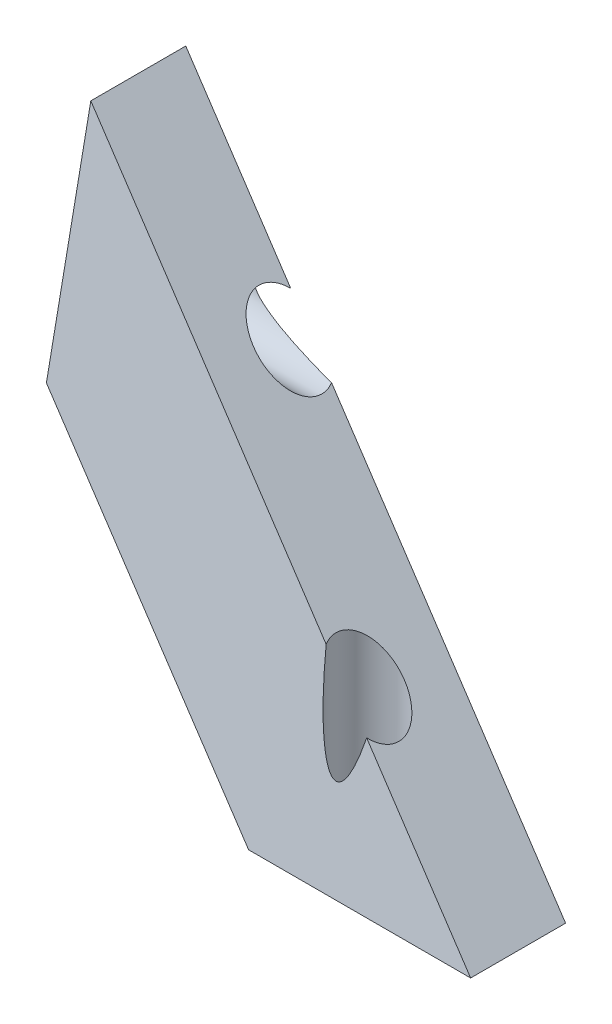
ISO-10303-21;
HEADER;
FILE_DESCRIPTION(('STEP AP214'),'2;1');
FILE_NAME('part.step','',(''),(''),'','','');
FILE_SCHEMA(('AUTOMOTIVE_DESIGN { 1 0 10303 214 1 1 1 1 }'));
ENDSEC;
DATA;
#1=APPLICATION_CONTEXT('core data for automotive mechanical design processes');
#2=APPLICATION_PROTOCOL_DEFINITION('international standard','automotive_design',2000,#1);
#3=PRODUCT_CONTEXT('',#1,'mechanical');
#4=PRODUCT('Part','Part','',(#3));
#5=PRODUCT_RELATED_PRODUCT_CATEGORY('part','',(#4));
#6=PRODUCT_DEFINITION_FORMATION('','',#4);
#7=PRODUCT_DEFINITION_CONTEXT('part definition',#1,'design');
#8=PRODUCT_DEFINITION('design','',#6,#7);
#9=PRODUCT_DEFINITION_SHAPE('','',#8);
#10=(LENGTH_UNIT() NAMED_UNIT(*) SI_UNIT(.MILLI.,.METRE.));
#11=(NAMED_UNIT(*) PLANE_ANGLE_UNIT() SI_UNIT($,.RADIAN.));
#12=(NAMED_UNIT(*) SI_UNIT($,.STERADIAN.) SOLID_ANGLE_UNIT());
#13=UNCERTAINTY_MEASURE_WITH_UNIT(LENGTH_MEASURE(1.E-05),#10,'distance_accuracy_value','');
#14=(GEOMETRIC_REPRESENTATION_CONTEXT(3) GLOBAL_UNCERTAINTY_ASSIGNED_CONTEXT((#13)) GLOBAL_UNIT_ASSIGNED_CONTEXT((#10,
#11,#12)) REPRESENTATION_CONTEXT('',''));
#15=CARTESIAN_POINT('',(0.,0.,0.));
#16=DIRECTION('',(0.,0.,1.));
#17=DIRECTION('',(1.,0.,0.));
#18=AXIS2_PLACEMENT_3D('',#15,#16,#17);
#19=CARTESIAN_POINT('',(-57.5079157734075,63.5,22.2464832070813));
#20=DIRECTION('',(1.,0.,0.));
#21=DIRECTION('',(0.,0.,-1.));
#22=AXIS2_PLACEMENT_3D('',#19,#20,#21);
#23=PLANE('',#22);
#24=DIRECTION('',(0.,0.,1.));
#25=VECTOR('',#24,1.);
#26=CARTESIAN_POINT('',(-57.5079157734075,53.4,1.24648320708115));
#27=LINE('',#26,#25);
#28=CARTESIAN_POINT('',(-57.5079157734075,53.4,2.74648320708115));
#29=VERTEX_POINT('',#28);
#30=CARTESIAN_POINT('',(-57.5079157734075,53.4,3.94648320708115));
#31=VERTEX_POINT('',#30);
#32=EDGE_CURVE('E202',#29,#31,#27,.T.);
#33=ORIENTED_EDGE('',*,*,#32,.F.);
#34=CARTESIAN_POINT('',(-57.5079157734075,54.9,2.74648320708115));
#35=DIRECTION('',(1.,0.,0.));
#36=DIRECTION('',(0.,0.,-1.));
#37=AXIS2_PLACEMENT_3D('',#34,#35,#36);
#38=CIRCLE('',#37,1.5);
#39=CARTESIAN_POINT('',(-57.5079157734075,54.9,1.24648320708115));
#40=VERTEX_POINT('',#39);
#41=EDGE_CURVE('E320',#29,#40,#38,.T.);
#42=ORIENTED_EDGE('',*,*,#41,.T.);
#43=DIRECTION('',(0.,-1.,0.));
#44=VECTOR('',#43,1.);
#45=CARTESIAN_POINT('',(-57.5079157734075,53.4,1.24648320708115));
#46=LINE('',#45,#44);
#47=CARTESIAN_POINT('',(-57.5079157734075,56.1,1.24648320708115));
#48=VERTEX_POINT('',#47);
#49=EDGE_CURVE('E213',#48,#40,#46,.T.);
#50=ORIENTED_EDGE('',*,*,#49,.F.);
#51=CARTESIAN_POINT('',(-57.5079157734075,56.1,2.74648320708115));
#52=DIRECTION('',(1.,0.,0.));
#53=DIRECTION('',(0.,0.,-1.));
#54=AXIS2_PLACEMENT_3D('',#51,#52,#53);
#55=CIRCLE('',#54,1.5);
#56=CARTESIAN_POINT('',(-57.5079157734075,57.6,2.74648320708115));
#57=VERTEX_POINT('',#56);
#58=EDGE_CURVE('E322',#48,#57,#55,.T.);
#59=ORIENTED_EDGE('',*,*,#58,.T.);
#60=DIRECTION('',(0.,0.,-1.));
#61=VECTOR('',#60,1.);
#62=CARTESIAN_POINT('',(-57.5079157734075,57.6,1.24648320708115));
#63=LINE('',#62,#61);
#64=CARTESIAN_POINT('',(-57.5079157734075,57.6,3.94648320708115));
#65=VERTEX_POINT('',#64);
#66=EDGE_CURVE('E228',#65,#57,#63,.T.);
#67=ORIENTED_EDGE('',*,*,#66,.F.);
#68=CARTESIAN_POINT('',(-57.5079157734075,56.1,3.94648320708115));
#69=DIRECTION('',(1.,0.,0.));
#70=DIRECTION('',(0.,0.,-1.));
#71=AXIS2_PLACEMENT_3D('',#68,#69,#70);
#72=CIRCLE('',#71,1.5);
#73=CARTESIAN_POINT('',(-57.5079157734075,56.1,5.44648320708115));
#74=VERTEX_POINT('',#73);
#75=EDGE_CURVE('E324',#65,#74,#72,.T.);
#76=ORIENTED_EDGE('',*,*,#75,.T.);
#77=DIRECTION('',(0.,1.,0.));
#78=VECTOR('',#77,1.);
#79=CARTESIAN_POINT('',(-57.5079157734075,53.4,5.44648320708115));
#80=LINE('',#79,#78);
#81=CARTESIAN_POINT('',(-57.5079157734075,54.9,5.44648320708115));
#82=VERTEX_POINT('',#81);
#83=EDGE_CURVE('E225',#82,#74,#80,.T.);
#84=ORIENTED_EDGE('',*,*,#83,.F.);
#85=CARTESIAN_POINT('',(-57.5079157734075,54.9,3.94648320708115));
#86=DIRECTION('',(1.,0.,0.));
#87=DIRECTION('',(0.,0.,-1.));
#88=AXIS2_PLACEMENT_3D('',#85,#86,#87);
#89=CIRCLE('',#88,1.5);
#90=EDGE_CURVE('E326',#82,#31,#89,.T.);
#91=ORIENTED_EDGE('',*,*,#90,.T.);
#92=EDGE_LOOP('',(#33,#42,#50,#59,#67,#76,#84,#91));
#93=FACE_BOUND('',#92,.T.);
#94=CARTESIAN_POINT('',(-57.5079157734075,43.,3.34648320708119));
#95=DIRECTION('',(1.,0.,0.));
#96=DIRECTION('',(0.,0.,-1.));
#97=AXIS2_PLACEMENT_3D('',#94,#95,#96);
#98=CIRCLE('',#97,2.385);
#99=CARTESIAN_POINT('',(-57.5079157734075,43.,0.961483207081194));
#100=VERTEX_POINT('',#99);
#101=EDGE_CURVE('E355',#100,#100,#98,.T.);
#102=ORIENTED_EDGE('',*,*,#101,.T.);
#103=EDGE_LOOP('',(#102));
#104=FACE_BOUND('',#103,.T.);
#105=DIRECTION('',(0.,0.,-1.));
#106=VECTOR('',#105,1.);
#107=CARTESIAN_POINT('',(-57.5079157734075,33.801515190165,22.2464832070813));
#108=LINE('',#107,#106);
#109=CARTESIAN_POINT('',(-57.5079157734075,33.801515190165,15.4861801690483));
#110=VERTEX_POINT('',#109);
#111=CARTESIAN_POINT('',(-57.5079157734075,33.801515190165,-3.15351679291868));
#112=VERTEX_POINT('',#111);
#113=EDGE_CURVE('E47',#110,#112,#108,.T.);
#114=ORIENTED_EDGE('',*,*,#113,.F.);
#115=DIRECTION('',(0.,-0.98058067569092,0.196116135138184));
#116=VECTOR('',#115,1.);
#117=CARTESIAN_POINT('',(-57.5079157734075,0.,22.2464832070813));
#118=LINE('',#117,#116);
#119=CARTESIAN_POINT('',(-57.5079157734075,63.5,9.54648320708132));
#120=VERTEX_POINT('',#119);
#121=EDGE_CURVE('E198',#120,#110,#118,.T.);
#122=ORIENTED_EDGE('',*,*,#121,.F.);
#123=DIRECTION('',(0.,0.,1.));
#124=VECTOR('',#123,1.);
#125=CARTESIAN_POINT('',(-57.5079157734075,63.5,22.2464832070813));
#126=LINE('',#125,#124);
#127=CARTESIAN_POINT('',(-57.5079157734075,63.5,-3.15351679291868));
#128=VERTEX_POINT('',#127);
#129=EDGE_CURVE('E256',#128,#120,#126,.T.);
#130=ORIENTED_EDGE('',*,*,#129,.F.);
#131=DIRECTION('',(0.,-1.,0.));
#132=VECTOR('',#131,1.);
#133=CARTESIAN_POINT('',(-57.5079157734075,63.5,-3.15351679291868));
#134=LINE('',#133,#132);
#135=EDGE_CURVE('E259',#128,#112,#134,.T.);
#136=ORIENTED_EDGE('',*,*,#135,.T.);
#137=EDGE_LOOP('',(#114,#122,#130,#136));
#138=FACE_BOUND('',#137,.T.);
#139=ADVANCED_FACE('F33',(#93,#104,#138),#23,.F.);
#140=CARTESIAN_POINT('',(0.,0.,0.));
#141=DIRECTION('',(0.,-1.,0.));
#142=DIRECTION('',(0.,0.,-1.));
#143=AXIS2_PLACEMENT_3D('',#140,#141,#142);
#144=PLANE('',#143);
#145=DIRECTION('',(0.,0.,-1.));
#146=VECTOR('',#145,1.);
#147=CARTESIAN_POINT('',(-3.70791577340748,0.,17.8464832070813));
#148=LINE('',#147,#146);
#149=CARTESIAN_POINT('',(-3.70791577340748,0.,16.3464832070813));
#150=VERTEX_POINT('',#149);
#151=CARTESIAN_POINT('',(-3.70791577340748,0.,15.1464832070813));
#152=VERTEX_POINT('',#151);
#153=EDGE_CURVE('E248',#150,#152,#148,.T.);
#154=ORIENTED_EDGE('',*,*,#153,.F.);
#155=CARTESIAN_POINT('',(-2.20791577340748,0.,16.3464832070813));
#156=DIRECTION('',(0.,-1.,0.));
#157=DIRECTION('',(0.,0.,-1.));
#158=AXIS2_PLACEMENT_3D('',#155,#156,#157);
#159=CIRCLE('',#158,1.5);
#160=CARTESIAN_POINT('',(-2.20791577340748,0.,17.8464832070813));
#161=VERTEX_POINT('',#160);
#162=EDGE_CURVE('E334',#150,#161,#159,.F.);
#163=ORIENTED_EDGE('',*,*,#162,.T.);
#164=DIRECTION('',(-1.,0.,0.));
#165=VECTOR('',#164,1.);
#166=CARTESIAN_POINT('',(-3.70791577340748,0.,17.8464832070813));
#167=LINE('',#166,#165);
#168=CARTESIAN_POINT('',(-1.00791577340747,0.,17.8464832070813));
#169=VERTEX_POINT('',#168);
#170=EDGE_CURVE('E222',#169,#161,#167,.T.);
#171=ORIENTED_EDGE('',*,*,#170,.F.);
#172=CARTESIAN_POINT('',(-1.00791577340747,0.,16.3464832070813));
#173=DIRECTION('',(0.,-1.,0.));
#174=DIRECTION('',(0.,0.,-1.));
#175=AXIS2_PLACEMENT_3D('',#172,#173,#174);
#176=CIRCLE('',#175,1.5);
#177=CARTESIAN_POINT('',(0.492084226592529,0.,16.3464832070813));
#178=VERTEX_POINT('',#177);
#179=EDGE_CURVE('E328',#169,#178,#176,.F.);
#180=ORIENTED_EDGE('',*,*,#179,.T.);
#181=DIRECTION('',(0.,0.,1.));
#182=VECTOR('',#181,1.);
#183=CARTESIAN_POINT('',(0.492084226592526,0.,17.8464832070813));
#184=LINE('',#183,#182);
#185=CARTESIAN_POINT('',(0.492084226592531,0.,15.1464832070813));
#186=VERTEX_POINT('',#185);
#187=EDGE_CURVE('E237',#186,#178,#184,.T.);
#188=ORIENTED_EDGE('',*,*,#187,.F.);
#189=CARTESIAN_POINT('',(-1.00791577340747,0.,15.1464832070813));
#190=DIRECTION('',(0.,-1.,0.));
#191=DIRECTION('',(0.,0.,-1.));
#192=AXIS2_PLACEMENT_3D('',#189,#190,#191);
#193=CIRCLE('',#192,1.5);
#194=CARTESIAN_POINT('',(-1.00791577340747,0.,13.6464832070813));
#195=VERTEX_POINT('',#194);
#196=EDGE_CURVE('E330',#186,#195,#193,.F.);
#197=ORIENTED_EDGE('',*,*,#196,.T.);
#198=DIRECTION('',(1.,0.,0.));
#199=VECTOR('',#198,1.);
#200=CARTESIAN_POINT('',(-3.70791577340748,0.,13.6464832070813));
#201=LINE('',#200,#199);
#202=CARTESIAN_POINT('',(-2.20791577340748,0.,13.6464832070813));
#203=VERTEX_POINT('',#202);
#204=EDGE_CURVE('E251',#203,#195,#201,.T.);
#205=ORIENTED_EDGE('',*,*,#204,.F.);
#206=CARTESIAN_POINT('',(-2.20791577340748,0.,15.1464832070813));
#207=DIRECTION('',(0.,-1.,0.));
#208=DIRECTION('',(0.,0.,-1.));
#209=AXIS2_PLACEMENT_3D('',#206,#207,#208);
#210=CIRCLE('',#209,1.5);
#211=EDGE_CURVE('E332',#203,#152,#210,.F.);
#212=ORIENTED_EDGE('',*,*,#211,.T.);
#213=EDGE_LOOP('',(#154,#163,#171,#180,#188,#197,#205,#212));
#214=FACE_BOUND('',#213,.T.);
#215=CARTESIAN_POINT('',(-14.3079157734075,0.,15.7464832070813));
#216=DIRECTION('',(0.,-1.,0.));
#217=DIRECTION('',(0.,0.,-1.));
#218=AXIS2_PLACEMENT_3D('',#215,#216,#217);
#219=CIRCLE('',#218,2.385);
#220=CARTESIAN_POINT('',(-14.3079157734075,0.,13.3614832070813));
#221=VERTEX_POINT('',#220);
#222=EDGE_CURVE('E199',#221,#221,#219,.T.);
#223=ORIENTED_EDGE('',*,*,#222,.F.);
#224=EDGE_LOOP('',(#223));
#225=FACE_BOUND('',#224,.T.);
#226=DIRECTION('',(1.,0.,0.));
#227=VECTOR('',#226,1.);
#228=CARTESIAN_POINT('',(-57.5079157734075,0.,22.2464832070813));
#229=LINE('',#228,#227);
#230=CARTESIAN_POINT('',(-23.7064005832425,0.,22.2464832070813));
#231=VERTEX_POINT('',#230);
#232=CARTESIAN_POINT('',(5.99208422659253,0.,22.2464832070813));
#233=VERTEX_POINT('',#232);
#234=EDGE_CURVE('E193',#231,#233,#229,.T.);
#235=ORIENTED_EDGE('',*,*,#234,.F.);
#236=DIRECTION('',(0.,0.,-1.));
#237=VECTOR('',#236,1.);
#238=CARTESIAN_POINT('',(-23.7064005832425,0.,0.));
#239=LINE('',#238,#237);
#240=CARTESIAN_POINT('',(-23.7064005832425,0.,3.60678624511432));
#241=VERTEX_POINT('',#240);
#242=EDGE_CURVE('E180',#231,#241,#239,.T.);
#243=ORIENTED_EDGE('',*,*,#242,.T.);
#244=DIRECTION('',(-0.98058067569092,0.,-0.196116135138184));
#245=VECTOR('',#244,1.);
#246=CARTESIAN_POINT('',(-57.5079157734075,0.,-3.15351679291868));
#247=LINE('',#246,#245);
#248=CARTESIAN_POINT('',(5.99208422659253,0.,9.54648320708132));
#249=VERTEX_POINT('',#248);
#250=EDGE_CURVE('E191',#249,#241,#247,.T.);
#251=ORIENTED_EDGE('',*,*,#250,.F.);
#252=DIRECTION('',(0.,0.,-1.));
#253=VECTOR('',#252,1.);
#254=CARTESIAN_POINT('',(5.99208422659253,0.,22.2464832070813));
#255=LINE('',#254,#253);
#256=EDGE_CURVE('E260',#233,#249,#255,.T.);
#257=ORIENTED_EDGE('',*,*,#256,.F.);
#258=EDGE_LOOP('',(#235,#243,#251,#257));
#259=FACE_BOUND('',#258,.T.);
#260=ADVANCED_FACE('F189',(#214,#225,#259),#144,.T.);
#261=CARTESIAN_POINT('',(5.99208422659253,0.,22.2464832070813));
#262=DIRECTION('',(0.,-0.196116135138184,-0.98058067569092));
#263=DIRECTION('',(0.,0.98058067569092,-0.196116135138184));
#264=AXIS2_PLACEMENT_3D('',#261,#262,#263);
#265=PLANE('',#264);
#266=DIRECTION('',(-0.700140042014005,0.700140042014005,-0.140028008402801));
#267=VECTOR('',#266,1.);
#268=CARTESIAN_POINT('',(-9.14831979410768,-14.5580807891348,25.1580993649083));
#269=LINE('',#268,#267);
#270=EDGE_CURVE('E375',#231,#110,#269,.T.);
#271=ORIENTED_EDGE('',*,*,#270,.F.);
#272=ORIENTED_EDGE('',*,*,#234,.T.);
#273=DIRECTION('',(0.700140042014005,-0.700140042014005,0.140028008402801));
#274=VECTOR('',#273,1.);
#275=CARTESIAN_POINT('',(-58.7530138126232,64.7450980392157,9.29746359923818));
#276=LINE('',#275,#274);
#277=CARTESIAN_POINT('',(-11.3923126336087,17.3843968602013,18.7696038350411));
#278=VERTEX_POINT('',#277);
#279=EDGE_CURVE('E336',#278,#233,#276,.T.);
#280=ORIENTED_EDGE('',*,*,#279,.F.);
#281=CARTESIAN_POINT('',(-14.3079157734075,32.5,15.7464832070813));
#282=DIRECTION('',(0.,-0.196116135138184,-0.98058067569092));
#283=DIRECTION('',(0.,-0.98058067569092,0.196116135138184));
#284=AXIS2_PLACEMENT_3D('',#281,#282,#283);
#285=ELLIPSE('',#284,21.4158819570897,4.2);
#286=CARTESIAN_POINT('',(-18.1619804516677,24.1540646782603,17.4156702714293));
#287=VERTEX_POINT('',#286);
#288=EDGE_CURVE('E342',#287,#278,#285,.F.);
#289=ORIENTED_EDGE('',*,*,#288,.F.);
#290=EDGE_CURVE('E337',#120,#287,#276,.T.);
#291=ORIENTED_EDGE('',*,*,#290,.F.);
#292=ORIENTED_EDGE('',*,*,#121,.T.);
#293=EDGE_LOOP('',(#271,#272,#280,#289,#291,#292));
#294=FACE_BOUND('',#293,.T.);
#295=ADVANCED_FACE('F365',(#294),#265,.F.);
#296=CARTESIAN_POINT('',(-57.5079157734075,63.5,-3.15351679291868));
#297=DIRECTION('',(-0.196116135138184,0.,0.98058067569092));
#298=DIRECTION('',(0.98058067569092,0.,0.196116135138184));
#299=AXIS2_PLACEMENT_3D('',#296,#297,#298);
#300=PLANE('',#299);
#301=DIRECTION('',(0.700140042014005,-0.700140042014005,0.140028008402801));
#302=VECTOR('',#301,1.);
#303=CARTESIAN_POINT('',(-72.0659965625423,48.3595959792998,-6.06513295074564));
#304=LINE('',#303,#302);
#305=EDGE_CURVE('E11',#112,#241,#304,.T.);
#306=ORIENTED_EDGE('',*,*,#305,.F.);
#307=ORIENTED_EDGE('',*,*,#135,.F.);
#308=DIRECTION('',(-0.700140042014005,0.700140042014005,-0.140028008402801));
#309=VECTOR('',#308,1.);
#310=CARTESIAN_POINT('',(-57.5079157734075,63.5,-3.15351679291868));
#311=LINE('',#310,#309);
#312=CARTESIAN_POINT('',(-39.9575493501217,45.9496335767142,0.356556491738479));
#313=VERTEX_POINT('',#312);
#314=EDGE_CURVE('E340',#313,#128,#311,.T.);
#315=ORIENTED_EDGE('',*,*,#314,.F.);
#316=CARTESIAN_POINT('',(-25.0079157734081,43.,3.34648320708119));
#317=DIRECTION('',(-0.196116135138184,0.,0.98058067569092));
#318=DIRECTION('',(0.98058067569092,0.,0.196116135138184));
#319=AXIS2_PLACEMENT_3D('',#316,#317,#318);
#320=ELLIPSE('',#319,21.4158819570897,4.2);
#321=CARTESIAN_POINT('',(-33.1352052736164,39.1272895002089,1.72102530703954));
#322=VERTEX_POINT('',#321);
#323=EDGE_CURVE('E41',#322,#313,#320,.F.);
#324=ORIENTED_EDGE('',*,*,#323,.F.);
#325=EDGE_CURVE('E197',#249,#322,#311,.T.);
#326=ORIENTED_EDGE('',*,*,#325,.F.);
#327=ORIENTED_EDGE('',*,*,#250,.T.);
#328=EDGE_LOOP('',(#306,#307,#315,#324,#326,#327));
#329=FACE_BOUND('',#328,.T.);
#330=ADVANCED_FACE('F195',(#329),#300,.F.);
#331=CARTESIAN_POINT('',(-14.3079157734075,63.5,15.7464832070813));
#332=DIRECTION('',(0.,-1.,0.));
#333=DIRECTION('',(0.,0.,-1.));
#334=AXIS2_PLACEMENT_3D('',#331,#332,#333);
#335=CYLINDRICAL_SURFACE('',#334,2.385);
#336=ORIENTED_EDGE('',*,*,#222,.T.);
#337=EDGE_LOOP('',(#336));
#338=FACE_BOUND('',#337,.T.);
#339=CARTESIAN_POINT('',(-14.3079157734075,5.2041474947892,15.7464832070813));
#340=DIRECTION('',(0.,1.,0.));
#341=DIRECTION('',(0.,0.,1.));
#342=AXIS2_PLACEMENT_3D('',#339,#340,#341);
#343=CIRCLE('',#342,2.385);
#344=CARTESIAN_POINT('',(-14.3079157734075,5.2041474947892,18.1314832070813));
#345=VERTEX_POINT('',#344);
#346=EDGE_CURVE('E343',#345,#345,#343,.F.);
#347=ORIENTED_EDGE('',*,*,#346,.F.);
#348=EDGE_LOOP('',(#347));
#349=FACE_BOUND('',#348,.T.);
#350=ADVANCED_FACE('F469',(#338,#349),#335,.F.);
#351=CARTESIAN_POINT('',(-57.5079157734075,63.5,-3.15351679291868));
#352=DIRECTION('',(-0.707106781186548,-0.707106781186548,0.));
#353=DIRECTION('',(0.707106781186548,-0.707106781186548,0.));
#354=AXIS2_PLACEMENT_3D('',#351,#352,#353);
#355=PLANE('',#354);
#356=CARTESIAN_POINT('',(-37.0079157734075,43.,3.34648320708119));
#357=DIRECTION('',(-0.707106781186548,-0.707106781186548,0.));
#358=DIRECTION('',(0.707106781186548,-0.707106781186548,0.));
#359=AXIS2_PLACEMENT_3D('',#356,#357,#358);
#360=ELLIPSE('',#359,5.939696961967,4.2);
#361=EDGE_CURVE('E54',#313,#322,#360,.F.);
#362=ORIENTED_EDGE('',*,*,#361,.F.);
#363=ORIENTED_EDGE('',*,*,#314,.T.);
#364=ORIENTED_EDGE('',*,*,#129,.T.);
#365=ORIENTED_EDGE('',*,*,#290,.T.);
#366=CARTESIAN_POINT('',(-14.3079157734075,20.3,15.7464832070813));
#367=DIRECTION('',(-0.707106781186548,-0.707106781186548,0.));
#368=DIRECTION('',(0.707106781186548,-0.707106781186548,0.));
#369=AXIS2_PLACEMENT_3D('',#366,#367,#368);
#370=ELLIPSE('',#369,5.939696961967,4.2);
#371=EDGE_CURVE('E205',#278,#287,#370,.F.);
#372=ORIENTED_EDGE('',*,*,#371,.F.);
#373=ORIENTED_EDGE('',*,*,#279,.T.);
#374=ORIENTED_EDGE('',*,*,#256,.T.);
#375=ORIENTED_EDGE('',*,*,#325,.T.);
#376=EDGE_LOOP('',(#362,#363,#364,#365,#372,#373,#374,#375));
#377=FACE_BOUND('',#376,.T.);
#378=ADVANCED_FACE('F354',(#377),#355,.F.);
#379=CARTESIAN_POINT('',(-3.70791577340748,-3.5,17.8464832070813));
#380=DIRECTION('',(0.,0.,-1.));
#381=DIRECTION('',(-1.,0.,0.));
#382=AXIS2_PLACEMENT_3D('',#379,#380,#381);
#383=PLANE('',#382);
#384=DIRECTION('',(-1.,0.,0.));
#385=VECTOR('',#384,1.);
#386=CARTESIAN_POINT('',(-3.70791577340748,-3.5,17.8464832070813));
#387=LINE('',#386,#385);
#388=CARTESIAN_POINT('',(-1.00791577340747,-3.5,17.8464832070813));
#389=VERTEX_POINT('',#388);
#390=CARTESIAN_POINT('',(-2.20791577340748,-3.5,17.8464832070813));
#391=VERTEX_POINT('',#390);
#392=EDGE_CURVE('E233',#389,#391,#387,.T.);
#393=ORIENTED_EDGE('',*,*,#392,.F.);
#394=DIRECTION('',(0.,1.,0.));
#395=VECTOR('',#394,1.);
#396=CARTESIAN_POINT('',(-1.00791577340747,-3.5,17.8464832070813));
#397=LINE('',#396,#395);
#398=EDGE_CURVE('E294',#389,#169,#397,.T.);
#399=ORIENTED_EDGE('',*,*,#398,.T.);
#400=ORIENTED_EDGE('',*,*,#170,.T.);
#401=DIRECTION('',(0.,1.,0.));
#402=VECTOR('',#401,1.);
#403=CARTESIAN_POINT('',(-2.20791577340748,-3.5,17.8464832070813));
#404=LINE('',#403,#402);
#405=EDGE_CURVE('E292',#161,#391,#404,.F.);
#406=ORIENTED_EDGE('',*,*,#405,.T.);
#407=EDGE_LOOP('',(#393,#399,#400,#406));
#408=FACE_BOUND('',#407,.T.);
#409=ADVANCED_FACE('F459',(#408),#383,.F.);
#410=CARTESIAN_POINT('',(-3.70791577340748,-3.5,17.8464832070813));
#411=DIRECTION('',(1.,0.,0.));
#412=DIRECTION('',(0.,0.,-1.));
#413=AXIS2_PLACEMENT_3D('',#410,#411,#412);
#414=PLANE('',#413);
#415=ORIENTED_EDGE('',*,*,#153,.T.);
#416=DIRECTION('',(0.,1.,0.));
#417=VECTOR('',#416,1.);
#418=CARTESIAN_POINT('',(-3.70791577340748,-3.5,15.1464832070813));
#419=LINE('',#418,#417);
#420=CARTESIAN_POINT('',(-3.70791577340748,-3.5,15.1464832070813));
#421=VERTEX_POINT('',#420);
#422=EDGE_CURVE('E318',#152,#421,#419,.F.);
#423=ORIENTED_EDGE('',*,*,#422,.T.);
#424=DIRECTION('',(0.,0.,-1.));
#425=VECTOR('',#424,1.);
#426=CARTESIAN_POINT('',(-3.70791577340748,-3.5,17.8464832070813));
#427=LINE('',#426,#425);
#428=CARTESIAN_POINT('',(-3.70791577340748,-3.5,16.3464832070813));
#429=VERTEX_POINT('',#428);
#430=EDGE_CURVE('E236',#429,#421,#427,.T.);
#431=ORIENTED_EDGE('',*,*,#430,.F.);
#432=DIRECTION('',(0.,1.,0.));
#433=VECTOR('',#432,1.);
#434=CARTESIAN_POINT('',(-3.70791577340748,-3.5,16.3464832070813));
#435=LINE('',#434,#433);
#436=EDGE_CURVE('E315',#429,#150,#435,.T.);
#437=ORIENTED_EDGE('',*,*,#436,.T.);
#438=EDGE_LOOP('',(#415,#423,#431,#437));
#439=FACE_BOUND('',#438,.T.);
#440=ADVANCED_FACE('F464',(#439),#414,.F.);
#441=CARTESIAN_POINT('',(-3.70791577340748,-3.5,13.6464832070813));
#442=DIRECTION('',(0.,0.,1.));
#443=DIRECTION('',(1.,0.,0.));
#444=AXIS2_PLACEMENT_3D('',#441,#442,#443);
#445=PLANE('',#444);
#446=ORIENTED_EDGE('',*,*,#204,.T.);
#447=DIRECTION('',(0.,1.,0.));
#448=VECTOR('',#447,1.);
#449=CARTESIAN_POINT('',(-1.00791577340747,-3.5,13.6464832070813));
#450=LINE('',#449,#448);
#451=CARTESIAN_POINT('',(-1.00791577340747,-3.5,13.6464832070813));
#452=VERTEX_POINT('',#451);
#453=EDGE_CURVE('E313',#195,#452,#450,.F.);
#454=ORIENTED_EDGE('',*,*,#453,.T.);
#455=DIRECTION('',(1.,0.,0.));
#456=VECTOR('',#455,1.);
#457=CARTESIAN_POINT('',(-3.70791577340748,-3.5,13.6464832070813));
#458=LINE('',#457,#456);
#459=CARTESIAN_POINT('',(-2.20791577340748,-3.5,13.6464832070813));
#460=VERTEX_POINT('',#459);
#461=EDGE_CURVE('E240',#460,#452,#458,.T.);
#462=ORIENTED_EDGE('',*,*,#461,.F.);
#463=DIRECTION('',(0.,1.,0.));
#464=VECTOR('',#463,1.);
#465=CARTESIAN_POINT('',(-2.20791577340748,-3.5,13.6464832070813));
#466=LINE('',#465,#464);
#467=EDGE_CURVE('E310',#460,#203,#466,.T.);
#468=ORIENTED_EDGE('',*,*,#467,.T.);
#469=EDGE_LOOP('',(#446,#454,#462,#468));
#470=FACE_BOUND('',#469,.T.);
#471=ADVANCED_FACE('F445',(#470),#445,.F.);
#472=CARTESIAN_POINT('',(0.492084226592526,-3.5,17.8464832070813));
#473=DIRECTION('',(-1.,0.,0.));
#474=DIRECTION('',(0.,0.,1.));
#475=AXIS2_PLACEMENT_3D('',#472,#473,#474);
#476=PLANE('',#475);
#477=ORIENTED_EDGE('',*,*,#187,.T.);
#478=DIRECTION('',(0.,1.,0.));
#479=VECTOR('',#478,1.);
#480=CARTESIAN_POINT('',(0.492084226592529,-3.5,16.3464832070813));
#481=LINE('',#480,#479);
#482=CARTESIAN_POINT('',(0.492084226592529,-3.5,16.3464832070813));
#483=VERTEX_POINT('',#482);
#484=EDGE_CURVE('E300',#178,#483,#481,.F.);
#485=ORIENTED_EDGE('',*,*,#484,.T.);
#486=DIRECTION('',(0.,0.,1.));
#487=VECTOR('',#486,1.);
#488=CARTESIAN_POINT('',(0.492084226592526,-3.5,17.8464832070813));
#489=LINE('',#488,#487);
#490=CARTESIAN_POINT('',(0.492084226592531,-3.5,15.1464832070813));
#491=VERTEX_POINT('',#490);
#492=EDGE_CURVE('E243',#491,#483,#489,.T.);
#493=ORIENTED_EDGE('',*,*,#492,.F.);
#494=DIRECTION('',(0.,1.,0.));
#495=VECTOR('',#494,1.);
#496=CARTESIAN_POINT('',(0.492084226592531,-3.5,15.1464832070813));
#497=LINE('',#496,#495);
#498=EDGE_CURVE('E297',#491,#186,#497,.T.);
#499=ORIENTED_EDGE('',*,*,#498,.T.);
#500=EDGE_LOOP('',(#477,#485,#493,#499));
#501=FACE_BOUND('',#500,.T.);
#502=ADVANCED_FACE('F452',(#501),#476,.F.);
#503=CARTESIAN_POINT('',(0.,-3.5,0.));
#504=DIRECTION('',(0.,1.,0.));
#505=DIRECTION('',(0.,0.,1.));
#506=AXIS2_PLACEMENT_3D('',#503,#504,#505);
#507=PLANE('',#506);
#508=ORIENTED_EDGE('',*,*,#492,.T.);
#509=CARTESIAN_POINT('',(-1.00791577340747,-3.5,16.3464832070813));
#510=DIRECTION('',(0.,1.,0.));
#511=DIRECTION('',(0.,0.,1.));
#512=AXIS2_PLACEMENT_3D('',#509,#510,#511);
#513=CIRCLE('',#512,1.5);
#514=EDGE_CURVE('E308',#483,#389,#513,.F.);
#515=ORIENTED_EDGE('',*,*,#514,.T.);
#516=ORIENTED_EDGE('',*,*,#392,.T.);
#517=CARTESIAN_POINT('',(-2.20791577340748,-3.5,16.3464832070813));
#518=DIRECTION('',(0.,1.,0.));
#519=DIRECTION('',(0.,0.,1.));
#520=AXIS2_PLACEMENT_3D('',#517,#518,#519);
#521=CIRCLE('',#520,1.5);
#522=EDGE_CURVE('E302',#391,#429,#521,.F.);
#523=ORIENTED_EDGE('',*,*,#522,.T.);
#524=ORIENTED_EDGE('',*,*,#430,.T.);
#525=CARTESIAN_POINT('',(-2.20791577340748,-3.5,15.1464832070813));
#526=DIRECTION('',(0.,1.,0.));
#527=DIRECTION('',(0.,0.,1.));
#528=AXIS2_PLACEMENT_3D('',#525,#526,#527);
#529=CIRCLE('',#528,1.5);
#530=EDGE_CURVE('E304',#421,#460,#529,.F.);
#531=ORIENTED_EDGE('',*,*,#530,.T.);
#532=ORIENTED_EDGE('',*,*,#461,.T.);
#533=CARTESIAN_POINT('',(-1.00791577340747,-3.5,15.1464832070813));
#534=DIRECTION('',(0.,1.,0.));
#535=DIRECTION('',(0.,0.,1.));
#536=AXIS2_PLACEMENT_3D('',#533,#534,#535);
#537=CIRCLE('',#536,1.5);
#538=EDGE_CURVE('E306',#452,#491,#537,.F.);
#539=ORIENTED_EDGE('',*,*,#538,.T.);
#540=EDGE_LOOP('',(#508,#515,#516,#523,#524,#531,#532,#539));
#541=FACE_BOUND('',#540,.T.);
#542=ADVANCED_FACE('F441',(#541),#507,.F.);
#543=CARTESIAN_POINT('',(-61.0079157734075,53.4,1.24648320708115));
#544=DIRECTION('',(0.,1.,0.));
#545=DIRECTION('',(0.,0.,1.));
#546=AXIS2_PLACEMENT_3D('',#543,#544,#545);
#547=PLANE('',#546);
#548=DIRECTION('',(0.,0.,1.));
#549=VECTOR('',#548,1.);
#550=CARTESIAN_POINT('',(-61.0079157734075,53.4,1.24648320708115));
#551=LINE('',#550,#549);
#552=CARTESIAN_POINT('',(-61.0079157734075,53.4,2.74648320708115));
#553=VERTEX_POINT('',#552);
#554=CARTESIAN_POINT('',(-61.0079157734075,53.4,3.94648320708115));
#555=VERTEX_POINT('',#554);
#556=EDGE_CURVE('E209',#553,#555,#551,.T.);
#557=ORIENTED_EDGE('',*,*,#556,.F.);
#558=DIRECTION('',(1.,0.,0.));
#559=VECTOR('',#558,1.);
#560=CARTESIAN_POINT('',(-61.0079157734075,53.4,2.74648320708115));
#561=LINE('',#560,#559);
#562=EDGE_CURVE('E266',#553,#29,#561,.T.);
#563=ORIENTED_EDGE('',*,*,#562,.T.);
#564=ORIENTED_EDGE('',*,*,#32,.T.);
#565=DIRECTION('',(1.,0.,0.));
#566=VECTOR('',#565,1.);
#567=CARTESIAN_POINT('',(-61.0079157734075,53.4,3.94648320708115));
#568=LINE('',#567,#566);
#569=EDGE_CURVE('E264',#31,#555,#568,.F.);
#570=ORIENTED_EDGE('',*,*,#569,.T.);
#571=EDGE_LOOP('',(#557,#563,#564,#570));
#572=FACE_BOUND('',#571,.T.);
#573=ADVANCED_FACE('F503',(#572),#547,.F.);
#574=CARTESIAN_POINT('',(-61.0079157734075,53.4,5.44648320708115));
#575=DIRECTION('',(0.,0.,-1.));
#576=DIRECTION('',(-1.,0.,0.));
#577=AXIS2_PLACEMENT_3D('',#574,#575,#576);
#578=PLANE('',#577);
#579=ORIENTED_EDGE('',*,*,#83,.T.);
#580=DIRECTION('',(1.,0.,0.));
#581=VECTOR('',#580,1.);
#582=CARTESIAN_POINT('',(-61.0079157734075,56.1,5.44648320708115));
#583=LINE('',#582,#581);
#584=CARTESIAN_POINT('',(-61.0079157734075,56.1,5.44648320708115));
#585=VERTEX_POINT('',#584);
#586=EDGE_CURVE('E290',#74,#585,#583,.F.);
#587=ORIENTED_EDGE('',*,*,#586,.T.);
#588=DIRECTION('',(0.,1.,0.));
#589=VECTOR('',#588,1.);
#590=CARTESIAN_POINT('',(-61.0079157734075,53.4,5.44648320708115));
#591=LINE('',#590,#589);
#592=CARTESIAN_POINT('',(-61.0079157734075,54.9,5.44648320708115));
#593=VERTEX_POINT('',#592);
#594=EDGE_CURVE('E212',#593,#585,#591,.T.);
#595=ORIENTED_EDGE('',*,*,#594,.F.);
#596=DIRECTION('',(1.,0.,0.));
#597=VECTOR('',#596,1.);
#598=CARTESIAN_POINT('',(-61.0079157734075,54.9,5.44648320708115));
#599=LINE('',#598,#597);
#600=EDGE_CURVE('E287',#593,#82,#599,.T.);
#601=ORIENTED_EDGE('',*,*,#600,.T.);
#602=EDGE_LOOP('',(#579,#587,#595,#601));
#603=FACE_BOUND('',#602,.T.);
#604=ADVANCED_FACE('F499',(#603),#578,.F.);
#605=CARTESIAN_POINT('',(-61.0079157734075,57.6,1.24648320708115));
#606=DIRECTION('',(0.,-1.,0.));
#607=DIRECTION('',(0.,0.,-1.));
#608=AXIS2_PLACEMENT_3D('',#605,#606,#607);
#609=PLANE('',#608);
#610=ORIENTED_EDGE('',*,*,#66,.T.);
#611=DIRECTION('',(1.,0.,0.));
#612=VECTOR('',#611,1.);
#613=CARTESIAN_POINT('',(-61.0079157734075,57.6,2.74648320708115));
#614=LINE('',#613,#612);
#615=CARTESIAN_POINT('',(-61.0079157734075,57.6,2.74648320708115));
#616=VERTEX_POINT('',#615);
#617=EDGE_CURVE('E285',#57,#616,#614,.F.);
#618=ORIENTED_EDGE('',*,*,#617,.T.);
#619=DIRECTION('',(0.,0.,-1.));
#620=VECTOR('',#619,1.);
#621=CARTESIAN_POINT('',(-61.0079157734075,57.6,1.24648320708115));
#622=LINE('',#621,#620);
#623=CARTESIAN_POINT('',(-61.0079157734075,57.6,3.94648320708115));
#624=VERTEX_POINT('',#623);
#625=EDGE_CURVE('E216',#624,#616,#622,.T.);
#626=ORIENTED_EDGE('',*,*,#625,.F.);
#627=DIRECTION('',(1.,0.,0.));
#628=VECTOR('',#627,1.);
#629=CARTESIAN_POINT('',(-61.0079157734075,57.6,3.94648320708115));
#630=LINE('',#629,#628);
#631=EDGE_CURVE('E282',#624,#65,#630,.T.);
#632=ORIENTED_EDGE('',*,*,#631,.T.);
#633=EDGE_LOOP('',(#610,#618,#626,#632));
#634=FACE_BOUND('',#633,.T.);
#635=ADVANCED_FACE('F495',(#634),#609,.F.);
#636=CARTESIAN_POINT('',(-61.0079157734075,53.4,1.24648320708115));
#637=DIRECTION('',(0.,0.,1.));
#638=DIRECTION('',(1.,0.,0.));
#639=AXIS2_PLACEMENT_3D('',#636,#637,#638);
#640=PLANE('',#639);
#641=ORIENTED_EDGE('',*,*,#49,.T.);
#642=DIRECTION('',(1.,0.,0.));
#643=VECTOR('',#642,1.);
#644=CARTESIAN_POINT('',(-61.0079157734075,54.9,1.24648320708115));
#645=LINE('',#644,#643);
#646=CARTESIAN_POINT('',(-61.0079157734075,54.9,1.24648320708115));
#647=VERTEX_POINT('',#646);
#648=EDGE_CURVE('E272',#40,#647,#645,.F.);
#649=ORIENTED_EDGE('',*,*,#648,.T.);
#650=DIRECTION('',(0.,-1.,0.));
#651=VECTOR('',#650,1.);
#652=CARTESIAN_POINT('',(-61.0079157734075,53.4,1.24648320708115));
#653=LINE('',#652,#651);
#654=CARTESIAN_POINT('',(-61.0079157734075,56.1,1.24648320708115));
#655=VERTEX_POINT('',#654);
#656=EDGE_CURVE('E219',#655,#647,#653,.T.);
#657=ORIENTED_EDGE('',*,*,#656,.F.);
#658=DIRECTION('',(1.,0.,0.));
#659=VECTOR('',#658,1.);
#660=CARTESIAN_POINT('',(-61.0079157734075,56.1,1.24648320708115));
#661=LINE('',#660,#659);
#662=EDGE_CURVE('E269',#655,#48,#661,.T.);
#663=ORIENTED_EDGE('',*,*,#662,.T.);
#664=EDGE_LOOP('',(#641,#649,#657,#663));
#665=FACE_BOUND('',#664,.T.);
#666=ADVANCED_FACE('F491',(#665),#640,.F.);
#667=CARTESIAN_POINT('',(-61.0079157734075,0.,0.));
#668=DIRECTION('',(-1.,0.,0.));
#669=DIRECTION('',(0.,0.,1.));
#670=AXIS2_PLACEMENT_3D('',#667,#668,#669);
#671=PLANE('',#670);
#672=ORIENTED_EDGE('',*,*,#656,.T.);
#673=CARTESIAN_POINT('',(-61.0079157734075,54.9,2.74648320708115));
#674=DIRECTION('',(-1.,0.,0.));
#675=DIRECTION('',(0.,0.,1.));
#676=AXIS2_PLACEMENT_3D('',#673,#674,#675);
#677=CIRCLE('',#676,1.5);
#678=EDGE_CURVE('E280',#647,#553,#677,.T.);
#679=ORIENTED_EDGE('',*,*,#678,.T.);
#680=ORIENTED_EDGE('',*,*,#556,.T.);
#681=CARTESIAN_POINT('',(-61.0079157734075,54.9,3.94648320708115));
#682=DIRECTION('',(-1.,0.,0.));
#683=DIRECTION('',(0.,0.,1.));
#684=AXIS2_PLACEMENT_3D('',#681,#682,#683);
#685=CIRCLE('',#684,1.5);
#686=EDGE_CURVE('E274',#555,#593,#685,.T.);
#687=ORIENTED_EDGE('',*,*,#686,.T.);
#688=ORIENTED_EDGE('',*,*,#594,.T.);
#689=CARTESIAN_POINT('',(-61.0079157734075,56.1,3.94648320708115));
#690=DIRECTION('',(-1.,0.,0.));
#691=DIRECTION('',(0.,0.,1.));
#692=AXIS2_PLACEMENT_3D('',#689,#690,#691);
#693=CIRCLE('',#692,1.5);
#694=EDGE_CURVE('E276',#585,#624,#693,.T.);
#695=ORIENTED_EDGE('',*,*,#694,.T.);
#696=ORIENTED_EDGE('',*,*,#625,.T.);
#697=CARTESIAN_POINT('',(-61.0079157734075,56.1,2.74648320708115));
#698=DIRECTION('',(-1.,0.,0.));
#699=DIRECTION('',(0.,0.,1.));
#700=AXIS2_PLACEMENT_3D('',#697,#698,#699);
#701=CIRCLE('',#700,1.5);
#702=EDGE_CURVE('E278',#616,#655,#701,.T.);
#703=ORIENTED_EDGE('',*,*,#702,.T.);
#704=EDGE_LOOP('',(#672,#679,#680,#687,#688,#695,#696,#703));
#705=FACE_BOUND('',#704,.T.);
#706=ADVANCED_FACE('F409',(#705),#671,.T.);
#707=CARTESIAN_POINT('',(-61.0079157734075,54.9,2.74648320708115));
#708=DIRECTION('',(1.,0.,0.));
#709=DIRECTION('',(0.,0.,-1.));
#710=AXIS2_PLACEMENT_3D('',#707,#708,#709);
#711=CYLINDRICAL_SURFACE('',#710,1.5);
#712=ORIENTED_EDGE('',*,*,#678,.F.);
#713=ORIENTED_EDGE('',*,*,#648,.F.);
#714=ORIENTED_EDGE('',*,*,#41,.F.);
#715=ORIENTED_EDGE('',*,*,#562,.F.);
#716=EDGE_LOOP('',(#712,#713,#714,#715));
#717=FACE_BOUND('',#716,.T.);
#718=ADVANCED_FACE('F405',(#717),#711,.T.);
#719=CARTESIAN_POINT('',(-61.0079157734075,56.1,2.74648320708115));
#720=DIRECTION('',(1.,0.,0.));
#721=DIRECTION('',(0.,0.,-1.));
#722=AXIS2_PLACEMENT_3D('',#719,#720,#721);
#723=CYLINDRICAL_SURFACE('',#722,1.5);
#724=ORIENTED_EDGE('',*,*,#702,.F.);
#725=ORIENTED_EDGE('',*,*,#617,.F.);
#726=ORIENTED_EDGE('',*,*,#58,.F.);
#727=ORIENTED_EDGE('',*,*,#662,.F.);
#728=EDGE_LOOP('',(#724,#725,#726,#727));
#729=FACE_BOUND('',#728,.T.);
#730=ADVANCED_FACE('F408',(#729),#723,.T.);
#731=CARTESIAN_POINT('',(-61.0079157734075,56.1,3.94648320708115));
#732=DIRECTION('',(1.,0.,0.));
#733=DIRECTION('',(0.,0.,-1.));
#734=AXIS2_PLACEMENT_3D('',#731,#732,#733);
#735=CYLINDRICAL_SURFACE('',#734,1.5);
#736=ORIENTED_EDGE('',*,*,#694,.F.);
#737=ORIENTED_EDGE('',*,*,#586,.F.);
#738=ORIENTED_EDGE('',*,*,#75,.F.);
#739=ORIENTED_EDGE('',*,*,#631,.F.);
#740=EDGE_LOOP('',(#736,#737,#738,#739));
#741=FACE_BOUND('',#740,.T.);
#742=ADVANCED_FACE('F413',(#741),#735,.T.);
#743=CARTESIAN_POINT('',(-61.0079157734075,54.9,3.94648320708115));
#744=DIRECTION('',(1.,0.,0.));
#745=DIRECTION('',(0.,0.,-1.));
#746=AXIS2_PLACEMENT_3D('',#743,#744,#745);
#747=CYLINDRICAL_SURFACE('',#746,1.5);
#748=ORIENTED_EDGE('',*,*,#686,.F.);
#749=ORIENTED_EDGE('',*,*,#569,.F.);
#750=ORIENTED_EDGE('',*,*,#90,.F.);
#751=ORIENTED_EDGE('',*,*,#600,.F.);
#752=EDGE_LOOP('',(#748,#749,#750,#751));
#753=FACE_BOUND('',#752,.T.);
#754=ADVANCED_FACE('F417',(#753),#747,.T.);
#755=CARTESIAN_POINT('',(-1.00791577340747,-3.5,16.3464832070813));
#756=DIRECTION('',(0.,1.,0.));
#757=DIRECTION('',(0.,0.,1.));
#758=AXIS2_PLACEMENT_3D('',#755,#756,#757);
#759=CYLINDRICAL_SURFACE('',#758,1.5);
#760=ORIENTED_EDGE('',*,*,#514,.F.);
#761=ORIENTED_EDGE('',*,*,#484,.F.);
#762=ORIENTED_EDGE('',*,*,#179,.F.);
#763=ORIENTED_EDGE('',*,*,#398,.F.);
#764=EDGE_LOOP('',(#760,#761,#762,#763));
#765=FACE_BOUND('',#764,.T.);
#766=ADVANCED_FACE('F421',(#765),#759,.T.);
#767=CARTESIAN_POINT('',(-1.00791577340747,-3.5,15.1464832070813));
#768=DIRECTION('',(0.,1.,0.));
#769=DIRECTION('',(0.,0.,1.));
#770=AXIS2_PLACEMENT_3D('',#767,#768,#769);
#771=CYLINDRICAL_SURFACE('',#770,1.5);
#772=ORIENTED_EDGE('',*,*,#538,.F.);
#773=ORIENTED_EDGE('',*,*,#453,.F.);
#774=ORIENTED_EDGE('',*,*,#196,.F.);
#775=ORIENTED_EDGE('',*,*,#498,.F.);
#776=EDGE_LOOP('',(#772,#773,#774,#775));
#777=FACE_BOUND('',#776,.T.);
#778=ADVANCED_FACE('F425',(#777),#771,.T.);
#779=CARTESIAN_POINT('',(-2.20791577340748,-3.5,15.1464832070813));
#780=DIRECTION('',(0.,1.,0.));
#781=DIRECTION('',(0.,0.,1.));
#782=AXIS2_PLACEMENT_3D('',#779,#780,#781);
#783=CYLINDRICAL_SURFACE('',#782,1.5);
#784=ORIENTED_EDGE('',*,*,#530,.F.);
#785=ORIENTED_EDGE('',*,*,#422,.F.);
#786=ORIENTED_EDGE('',*,*,#211,.F.);
#787=ORIENTED_EDGE('',*,*,#467,.F.);
#788=EDGE_LOOP('',(#784,#785,#786,#787));
#789=FACE_BOUND('',#788,.T.);
#790=ADVANCED_FACE('F428',(#789),#783,.T.);
#791=CARTESIAN_POINT('',(-2.20791577340748,-3.5,16.3464832070813));
#792=DIRECTION('',(0.,1.,0.));
#793=DIRECTION('',(0.,0.,1.));
#794=AXIS2_PLACEMENT_3D('',#791,#792,#793);
#795=CYLINDRICAL_SURFACE('',#794,1.5);
#796=ORIENTED_EDGE('',*,*,#522,.F.);
#797=ORIENTED_EDGE('',*,*,#405,.F.);
#798=ORIENTED_EDGE('',*,*,#162,.F.);
#799=ORIENTED_EDGE('',*,*,#436,.F.);
#800=EDGE_LOOP('',(#796,#797,#798,#799));
#801=FACE_BOUND('',#800,.T.);
#802=ADVANCED_FACE('F35',(#801),#795,.T.);
#803=CARTESIAN_POINT('',(-14.3079157734075,33.2041474947892,15.7464832070813));
#804=DIRECTION('',(0.,-1.,0.));
#805=DIRECTION('',(0.,0.,-1.));
#806=AXIS2_PLACEMENT_3D('',#803,#804,#805);
#807=CYLINDRICAL_SURFACE('',#806,4.2);
#808=CARTESIAN_POINT('',(-14.3079157734075,5.20414749478921,15.7464832070813));
#809=DIRECTION('',(0.,1.,0.));
#810=DIRECTION('',(0.,0.,1.));
#811=AXIS2_PLACEMENT_3D('',#808,#809,#810);
#812=CIRCLE('',#811,4.2);
#813=CARTESIAN_POINT('',(-14.3079157734075,5.20414749478921,19.9464832070813));
#814=VERTEX_POINT('',#813);
#815=EDGE_CURVE('E346',#814,#814,#812,.T.);
#816=ORIENTED_EDGE('',*,*,#815,.F.);
#817=EDGE_LOOP('',(#816));
#818=FACE_BOUND('',#817,.T.);
#819=ORIENTED_EDGE('',*,*,#371,.T.);
#820=ORIENTED_EDGE('',*,*,#288,.T.);
#821=EDGE_LOOP('',(#819,#820));
#822=FACE_BOUND('',#821,.T.);
#823=ADVANCED_FACE('F367',(#818,#822),#807,.F.);
#824=CARTESIAN_POINT('',(-14.3079157734075,5.20414749478921,15.7464832070813));
#825=DIRECTION('',(0.,1.,0.));
#826=DIRECTION('',(0.,0.,1.));
#827=AXIS2_PLACEMENT_3D('',#824,#825,#826);
#828=PLANE('',#827);
#829=ORIENTED_EDGE('',*,*,#815,.T.);
#830=EDGE_LOOP('',(#829));
#831=FACE_BOUND('',#830,.T.);
#832=ORIENTED_EDGE('',*,*,#346,.T.);
#833=EDGE_LOOP('',(#832));
#834=FACE_BOUND('',#833,.T.);
#835=ADVANCED_FACE('F389',(#831,#834),#828,.T.);
#836=CARTESIAN_POINT('',(5.99208422659253,43.,3.34648320708119));
#837=DIRECTION('',(-1.,0.,0.));
#838=DIRECTION('',(0.,0.,1.));
#839=AXIS2_PLACEMENT_3D('',#836,#837,#838);
#840=CYLINDRICAL_SURFACE('',#839,2.385);
#841=CARTESIAN_POINT('',(-53.5531455431456,43.,3.34648320708119));
#842=DIRECTION('',(-1.,0.,0.));
#843=DIRECTION('',(0.,0.,1.));
#844=AXIS2_PLACEMENT_3D('',#841,#842,#843);
#845=CIRCLE('',#844,2.385);
#846=CARTESIAN_POINT('',(-53.5531455431456,43.,5.73148320708119));
#847=VERTEX_POINT('',#846);
#848=EDGE_CURVE('E348',#847,#847,#845,.F.);
#849=ORIENTED_EDGE('',*,*,#848,.T.);
#850=EDGE_LOOP('',(#849));
#851=FACE_BOUND('',#850,.T.);
#852=ORIENTED_EDGE('',*,*,#101,.F.);
#853=EDGE_LOOP('',(#852));
#854=FACE_BOUND('',#853,.T.);
#855=ADVANCED_FACE('F386',(#851,#854),#840,.F.);
#856=CARTESIAN_POINT('',(-53.5531455431456,43.,3.34648320708119));
#857=DIRECTION('',(1.,0.,0.));
#858=DIRECTION('',(0.,0.,-1.));
#859=AXIS2_PLACEMENT_3D('',#856,#857,#858);
#860=CYLINDRICAL_SURFACE('',#859,4.2);
#861=CARTESIAN_POINT('',(-53.5531455431456,43.,3.34648320708119));
#862=DIRECTION('',(-1.,0.,0.));
#863=DIRECTION('',(0.,0.,1.));
#864=AXIS2_PLACEMENT_3D('',#861,#862,#863);
#865=CIRCLE('',#864,4.2);
#866=CARTESIAN_POINT('',(-53.5531455431456,43.,7.5464832070812));
#867=VERTEX_POINT('',#866);
#868=EDGE_CURVE('E350',#867,#867,#865,.T.);
#869=ORIENTED_EDGE('',*,*,#868,.T.);
#870=EDGE_LOOP('',(#869));
#871=FACE_BOUND('',#870,.T.);
#872=ORIENTED_EDGE('',*,*,#361,.T.);
#873=ORIENTED_EDGE('',*,*,#323,.T.);
#874=EDGE_LOOP('',(#872,#873));
#875=FACE_BOUND('',#874,.T.);
#876=ADVANCED_FACE('F351',(#871,#875),#860,.F.);
#877=CARTESIAN_POINT('',(-53.5531455431456,43.,3.34648320708119));
#878=DIRECTION('',(-1.,0.,0.));
#879=DIRECTION('',(0.,0.,1.));
#880=AXIS2_PLACEMENT_3D('',#877,#878,#879);
#881=PLANE('',#880);
#882=ORIENTED_EDGE('',*,*,#868,.F.);
#883=EDGE_LOOP('',(#882));
#884=FACE_BOUND('',#883,.T.);
#885=ORIENTED_EDGE('',*,*,#848,.F.);
#886=EDGE_LOOP('',(#885));
#887=FACE_BOUND('',#886,.T.);
#888=ADVANCED_FACE('F380',(#884,#887),#881,.F.);
#889=CARTESIAN_POINT('',(-11.8532002916212,-11.8532002916212,0.));
#890=DIRECTION('',(-0.707106781186548,-0.707106781186547,0.));
#891=DIRECTION('',(0.707106781186547,-0.707106781186548,0.));
#892=AXIS2_PLACEMENT_3D('',#889,#890,#891);
#893=PLANE('',#892);
#894=ORIENTED_EDGE('',*,*,#270,.T.);
#895=ORIENTED_EDGE('',*,*,#113,.T.);
#896=ORIENTED_EDGE('',*,*,#305,.T.);
#897=ORIENTED_EDGE('',*,*,#242,.F.);
#898=EDGE_LOOP('',(#894,#895,#896,#897));
#899=FACE_BOUND('',#898,.T.);
#900=ADVANCED_FACE('F179',(#899),#893,.T.);
#901=CLOSED_SHELL('',(#139,#260,#295,#330,#350,#378,#409,#440,#471,#502,#542,#573,#604,#635,
#666,#706,#718,#730,#742,#754,#766,#778,#790,#802,#823,#835,#855,#876,#888,#900));
#902=MANIFOLD_SOLID_BREP('B2',#901);
#903=ADVANCED_BREP_SHAPE_REPRESENTATION('',(#18,#902),#14);
#904=SHAPE_DEFINITION_REPRESENTATION(#9,#903);
ENDSEC;
END-ISO-10303-21;
